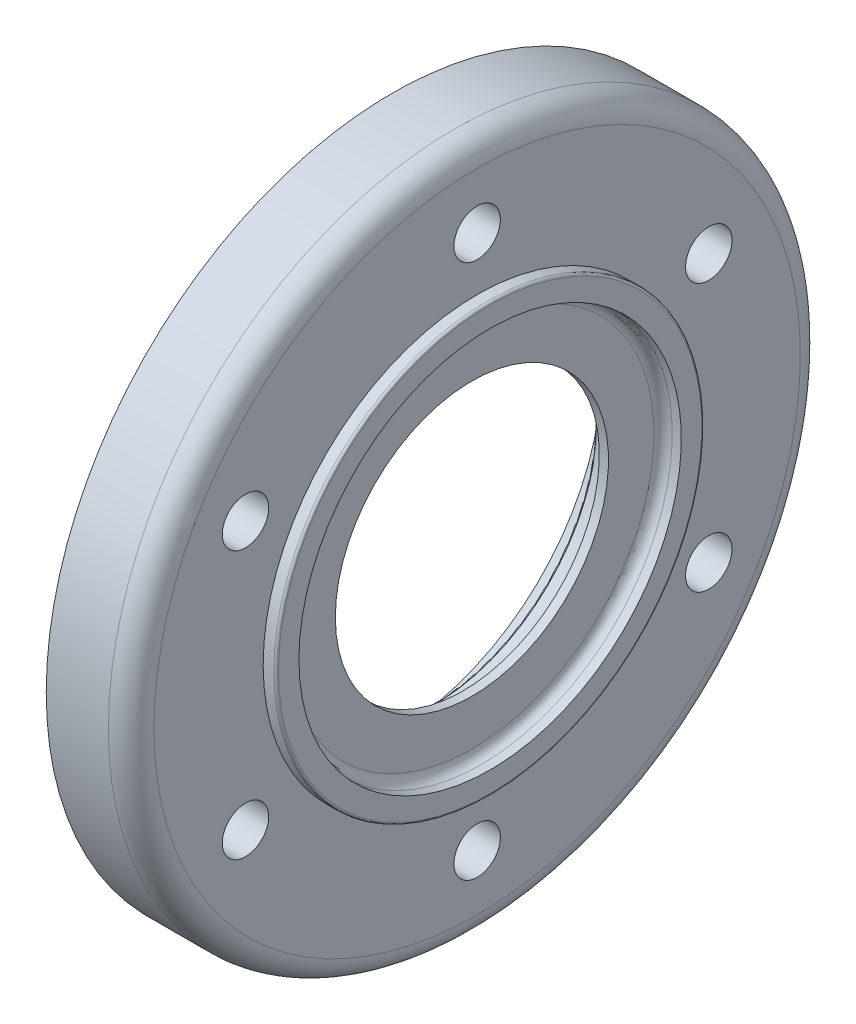
ISO-10303-21;
HEADER;
FILE_DESCRIPTION(('STEP AP214'),'2;1');
FILE_NAME('part.step','',(''),(''),'','','');
FILE_SCHEMA(('AUTOMOTIVE_DESIGN { 1 0 10303 214 1 1 1 1 }'));
ENDSEC;
DATA;
#1=APPLICATION_CONTEXT('core data for automotive mechanical design processes');
#2=APPLICATION_PROTOCOL_DEFINITION('international standard','automotive_design',2000,#1);
#3=PRODUCT_CONTEXT('',#1,'mechanical');
#4=PRODUCT('Part','Part','',(#3));
#5=PRODUCT_RELATED_PRODUCT_CATEGORY('part','',(#4));
#6=PRODUCT_DEFINITION_FORMATION('','',#4);
#7=PRODUCT_DEFINITION_CONTEXT('part definition',#1,'design');
#8=PRODUCT_DEFINITION('design','',#6,#7);
#9=PRODUCT_DEFINITION_SHAPE('','',#8);
#10=(LENGTH_UNIT() NAMED_UNIT(*) SI_UNIT(.MILLI.,.METRE.));
#11=(NAMED_UNIT(*) PLANE_ANGLE_UNIT() SI_UNIT($,.RADIAN.));
#12=(NAMED_UNIT(*) SI_UNIT($,.STERADIAN.) SOLID_ANGLE_UNIT());
#13=UNCERTAINTY_MEASURE_WITH_UNIT(LENGTH_MEASURE(1.E-05),#10,'distance_accuracy_value','');
#14=(GEOMETRIC_REPRESENTATION_CONTEXT(3) GLOBAL_UNCERTAINTY_ASSIGNED_CONTEXT((#13)) GLOBAL_UNIT_ASSIGNED_CONTEXT((#10,
#11,#12)) REPRESENTATION_CONTEXT('',''));
#15=CARTESIAN_POINT('',(0.,0.,0.));
#16=DIRECTION('',(0.,0.,1.));
#17=DIRECTION('',(1.,0.,0.));
#18=AXIS2_PLACEMENT_3D('',#15,#16,#17);
#19=CARTESIAN_POINT('',(0.595225647379466,0.,-36.));
#20=DIRECTION('',(1.,0.,0.));
#21=DIRECTION('',(0.,0.,-1.));
#22=AXIS2_PLACEMENT_3D('',#19,#20,#21);
#23=PLANE('',#22);
#24=CARTESIAN_POINT('',(0.595225647379467,0.,0.));
#25=DIRECTION('',(-1.,0.,0.));
#26=DIRECTION('',(0.,0.,1.));
#27=AXIS2_PLACEMENT_3D('',#24,#25,#26);
#28=CIRCLE('',#27,30.);
#29=CARTESIAN_POINT('',(0.595225647379467,0.,30.));
#30=VERTEX_POINT('',#29);
#31=EDGE_CURVE('E85',#30,#30,#28,.T.);
#32=ORIENTED_EDGE('',*,*,#31,.F.);
#33=EDGE_LOOP('',(#32));
#34=FACE_BOUND('',#33,.T.);
#35=CARTESIAN_POINT('',(0.595225647379466,0.,0.));
#36=DIRECTION('',(-1.,0.,0.));
#37=DIRECTION('',(0.,0.,1.));
#38=AXIS2_PLACEMENT_3D('',#35,#36,#37);
#39=CIRCLE('',#38,36.);
#40=CARTESIAN_POINT('',(0.595225647379466,0.,36.));
#41=VERTEX_POINT('',#40);
#42=EDGE_CURVE('E67',#41,#41,#39,.T.);
#43=ORIENTED_EDGE('',*,*,#42,.T.);
#44=EDGE_LOOP('',(#43));
#45=FACE_BOUND('',#44,.T.);
#46=ADVANCED_FACE('F41',(#34,#45),#23,.F.);
#47=CARTESIAN_POINT('',(0.,0.,0.));
#48=DIRECTION('',(-1.,0.,0.));
#49=DIRECTION('',(0.,0.,1.));
#50=AXIS2_PLACEMENT_3D('',#47,#48,#49);
#51=CYLINDRICAL_SURFACE('',#50,36.);
#52=CARTESIAN_POINT('',(-5.90477435262053,0.,0.));
#53=DIRECTION('',(1.,0.,0.));
#54=DIRECTION('',(0.,0.,-1.));
#55=AXIS2_PLACEMENT_3D('',#52,#53,#54);
#56=CIRCLE('',#55,36.);
#57=CARTESIAN_POINT('',(-5.90477435262053,0.,-36.));
#58=VERTEX_POINT('',#57);
#59=EDGE_CURVE('E64',#58,#58,#56,.F.);
#60=ORIENTED_EDGE('',*,*,#59,.T.);
#61=EDGE_LOOP('',(#60));
#62=FACE_BOUND('',#61,.T.);
#63=ORIENTED_EDGE('',*,*,#42,.F.);
#64=EDGE_LOOP('',(#63));
#65=FACE_BOUND('',#64,.T.);
#66=ADVANCED_FACE('F162',(#62,#65),#51,.F.);
#67=CARTESIAN_POINT('',(-6.40477435262053,0.,-46.));
#68=DIRECTION('',(1.,0.,0.));
#69=DIRECTION('',(0.,0.,-1.));
#70=AXIS2_PLACEMENT_3D('',#67,#68,#69);
#71=PLANE('',#70);
#72=CARTESIAN_POINT('',(-6.40477435262053,0.,0.));
#73=DIRECTION('',(1.,0.,0.));
#74=DIRECTION('',(0.,0.,-1.));
#75=AXIS2_PLACEMENT_3D('',#72,#73,#74);
#76=CIRCLE('',#75,36.5);
#77=CARTESIAN_POINT('',(-6.40477435262053,0.,-36.5));
#78=VERTEX_POINT('',#77);
#79=EDGE_CURVE('E61',#78,#78,#76,.T.);
#80=ORIENTED_EDGE('',*,*,#79,.T.);
#81=EDGE_LOOP('',(#80));
#82=FACE_BOUND('',#81,.T.);
#83=CARTESIAN_POINT('',(-6.40477435262053,0.,0.));
#84=DIRECTION('',(1.,0.,0.));
#85=DIRECTION('',(0.,0.,-1.));
#86=AXIS2_PLACEMENT_3D('',#83,#84,#85);
#87=CIRCLE('',#86,46.);
#88=CARTESIAN_POINT('',(-6.40477435262053,0.,-46.));
#89=VERTEX_POINT('',#88);
#90=EDGE_CURVE('E88',#89,#89,#87,.F.);
#91=ORIENTED_EDGE('',*,*,#90,.T.);
#92=EDGE_LOOP('',(#91));
#93=FACE_BOUND('',#92,.T.);
#94=ADVANCED_FACE('F152',(#82,#93),#71,.F.);
#95=CARTESIAN_POINT('',(0.,0.,0.));
#96=DIRECTION('',(-1.,0.,0.));
#97=DIRECTION('',(0.,0.,1.));
#98=AXIS2_PLACEMENT_3D('',#95,#96,#97);
#99=CYLINDRICAL_SURFACE('',#98,76.);
#100=CARTESIAN_POINT('',(-1.25563941521428,0.,0.));
#101=DIRECTION('',(-1.,0.,0.));
#102=DIRECTION('',(0.,0.,1.));
#103=AXIS2_PLACEMENT_3D('',#100,#101,#102);
#104=CIRCLE('',#103,76.);
#105=CARTESIAN_POINT('',(-1.25563941521428,0.,76.));
#106=VERTEX_POINT('',#105);
#107=EDGE_CURVE('E49',#106,#106,#104,.T.);
#108=ORIENTED_EDGE('',*,*,#107,.T.);
#109=EDGE_LOOP('',(#108));
#110=FACE_BOUND('',#109,.T.);
#111=CARTESIAN_POINT('',(-14.9047743526208,0.,0.));
#112=DIRECTION('',(1.,0.,0.));
#113=DIRECTION('',(0.,0.,-1.));
#114=AXIS2_PLACEMENT_3D('',#111,#112,#113);
#115=CIRCLE('',#114,76.);
#116=CARTESIAN_POINT('',(-14.9047743526208,0.,-76.));
#117=VERTEX_POINT('',#116);
#118=EDGE_CURVE('E109',#117,#117,#115,.T.);
#119=ORIENTED_EDGE('',*,*,#118,.T.);
#120=EDGE_LOOP('',(#119));
#121=FACE_BOUND('',#120,.T.);
#122=ADVANCED_FACE('F149',(#110,#121),#99,.T.);
#123=CARTESIAN_POINT('',(3.74436058478572,0.,-47.));
#124=DIRECTION('',(-1.,0.,0.));
#125=DIRECTION('',(0.,0.,1.));
#126=AXIS2_PLACEMENT_3D('',#123,#124,#125);
#127=PLANE('',#126);
#128=CARTESIAN_POINT('',(3.74436058478572,58.75,0.));
#129=DIRECTION('',(1.,0.,0.));
#130=DIRECTION('',(0.,0.,-1.));
#131=AXIS2_PLACEMENT_3D('',#128,#129,#130);
#132=CIRCLE('',#131,5.09999999999999);
#133=CARTESIAN_POINT('',(3.74436058478572,58.75,-5.1));
#134=VERTEX_POINT('',#133);
#135=EDGE_CURVE('E106',#134,#134,#132,.T.);
#136=ORIENTED_EDGE('',*,*,#135,.F.);
#137=EDGE_LOOP('',(#136));
#138=FACE_BOUND('',#137,.T.);
#139=CARTESIAN_POINT('',(3.74436058478572,29.3750000000022,-50.878992472337));
#140=DIRECTION('',(1.,0.,0.));
#141=DIRECTION('',(0.,0.,-1.));
#142=AXIS2_PLACEMENT_3D('',#139,#140,#141);
#143=CIRCLE('',#142,5.09999999999999);
#144=CARTESIAN_POINT('',(3.74436058478572,29.3750000000022,-55.978992472337));
#145=VERTEX_POINT('',#144);
#146=EDGE_CURVE('E103',#145,#145,#143,.T.);
#147=ORIENTED_EDGE('',*,*,#146,.F.);
#148=EDGE_LOOP('',(#147));
#149=FACE_BOUND('',#148,.T.);
#150=CARTESIAN_POINT('',(3.74436058478572,-29.3749999999978,-50.8789924723395));
#151=DIRECTION('',(1.,0.,0.));
#152=DIRECTION('',(0.,0.,-1.));
#153=AXIS2_PLACEMENT_3D('',#150,#151,#152);
#154=CIRCLE('',#153,5.1);
#155=CARTESIAN_POINT('',(3.74436058478572,-29.3749999999978,-55.9789924723395));
#156=VERTEX_POINT('',#155);
#157=EDGE_CURVE('E100',#156,#156,#154,.T.);
#158=ORIENTED_EDGE('',*,*,#157,.F.);
#159=EDGE_LOOP('',(#158));
#160=FACE_BOUND('',#159,.T.);
#161=CARTESIAN_POINT('',(3.74436058478572,-58.75,-4.98924207960269E-12));
#162=DIRECTION('',(1.,0.,0.));
#163=DIRECTION('',(0.,0.,-1.));
#164=AXIS2_PLACEMENT_3D('',#161,#162,#163);
#165=CIRCLE('',#164,5.09999999999999);
#166=CARTESIAN_POINT('',(3.74436058478572,-58.75,-5.10000000000498));
#167=VERTEX_POINT('',#166);
#168=EDGE_CURVE('E97',#167,#167,#165,.T.);
#169=ORIENTED_EDGE('',*,*,#168,.F.);
#170=EDGE_LOOP('',(#169));
#171=FACE_BOUND('',#170,.T.);
#172=CARTESIAN_POINT('',(3.74436058478572,-29.3750000000022,50.878992472332));
#173=DIRECTION('',(1.,0.,0.));
#174=DIRECTION('',(0.,0.,-1.));
#175=AXIS2_PLACEMENT_3D('',#172,#173,#174);
#176=CIRCLE('',#175,5.09999999999999);
#177=CARTESIAN_POINT('',(3.74436058478572,-29.3750000000022,45.778992472332));
#178=VERTEX_POINT('',#177);
#179=EDGE_CURVE('E94',#178,#178,#176,.T.);
#180=ORIENTED_EDGE('',*,*,#179,.F.);
#181=EDGE_LOOP('',(#180));
#182=FACE_BOUND('',#181,.T.);
#183=CARTESIAN_POINT('',(3.74436058478572,29.3749999999979,50.8789924723345));
#184=DIRECTION('',(1.,0.,0.));
#185=DIRECTION('',(0.,0.,-1.));
#186=AXIS2_PLACEMENT_3D('',#183,#184,#185);
#187=CIRCLE('',#186,5.1);
#188=CARTESIAN_POINT('',(3.74436058478572,29.3749999999979,45.7789924723345));
#189=VERTEX_POINT('',#188);
#190=EDGE_CURVE('E91',#189,#189,#187,.T.);
#191=ORIENTED_EDGE('',*,*,#190,.F.);
#192=EDGE_LOOP('',(#191));
#193=FACE_BOUND('',#192,.T.);
#194=CARTESIAN_POINT('',(3.74436058478572,0.,0.));
#195=DIRECTION('',(-1.,0.,0.));
#196=DIRECTION('',(0.,0.,1.));
#197=AXIS2_PLACEMENT_3D('',#194,#195,#196);
#198=CIRCLE('',#197,71.);
#199=CARTESIAN_POINT('',(3.74436058478572,0.,71.));
#200=VERTEX_POINT('',#199);
#201=EDGE_CURVE('E10',#200,#200,#198,.F.);
#202=ORIENTED_EDGE('',*,*,#201,.T.);
#203=EDGE_LOOP('',(#202));
#204=FACE_BOUND('',#203,.T.);
#205=CARTESIAN_POINT('',(3.74436058478572,0.,0.));
#206=DIRECTION('',(-1.,0.,0.));
#207=DIRECTION('',(0.,0.,1.));
#208=AXIS2_PLACEMENT_3D('',#205,#206,#207);
#209=CIRCLE('',#208,47.);
#210=CARTESIAN_POINT('',(3.74436058478572,0.,47.));
#211=VERTEX_POINT('',#210);
#212=EDGE_CURVE('E70',#211,#211,#209,.T.);
#213=ORIENTED_EDGE('',*,*,#212,.T.);
#214=EDGE_LOOP('',(#213));
#215=FACE_BOUND('',#214,.T.);
#216=ADVANCED_FACE('F151',(#138,#149,#160,#171,#182,#193,#204,#215),#127,.F.);
#217=CARTESIAN_POINT('',(0.,0.,0.));
#218=DIRECTION('',(-1.,0.,0.));
#219=DIRECTION('',(0.,0.,1.));
#220=AXIS2_PLACEMENT_3D('',#217,#218,#219);
#221=CYLINDRICAL_SURFACE('',#220,47.);
#222=CARTESIAN_POINT('',(6.09522564737947,0.,0.));
#223=DIRECTION('',(-1.,0.,0.));
#224=DIRECTION('',(0.,0.,1.));
#225=AXIS2_PLACEMENT_3D('',#222,#223,#224);
#226=CIRCLE('',#225,47.);
#227=CARTESIAN_POINT('',(6.09522564737947,0.,47.));
#228=VERTEX_POINT('',#227);
#229=EDGE_CURVE('E58',#228,#228,#226,.T.);
#230=ORIENTED_EDGE('',*,*,#229,.T.);
#231=EDGE_LOOP('',(#230));
#232=FACE_BOUND('',#231,.T.);
#233=ORIENTED_EDGE('',*,*,#212,.F.);
#234=EDGE_LOOP('',(#233));
#235=FACE_BOUND('',#234,.T.);
#236=ADVANCED_FACE('F159',(#232,#235),#221,.T.);
#237=CARTESIAN_POINT('',(6.59522564737947,0.,-42.));
#238=DIRECTION('',(-1.,0.,0.));
#239=DIRECTION('',(0.,0.,1.));
#240=AXIS2_PLACEMENT_3D('',#237,#238,#239);
#241=PLANE('',#240);
#242=CARTESIAN_POINT('',(6.59522564737947,0.,0.));
#243=DIRECTION('',(-1.,0.,0.));
#244=DIRECTION('',(0.,0.,1.));
#245=AXIS2_PLACEMENT_3D('',#242,#243,#244);
#246=CIRCLE('',#245,46.5);
#247=CARTESIAN_POINT('',(6.59522564737947,0.,46.5));
#248=VERTEX_POINT('',#247);
#249=EDGE_CURVE('E53',#248,#248,#246,.F.);
#250=ORIENTED_EDGE('',*,*,#249,.T.);
#251=EDGE_LOOP('',(#250));
#252=FACE_BOUND('',#251,.T.);
#253=CARTESIAN_POINT('',(6.59522564737947,0.,0.));
#254=DIRECTION('',(-1.,0.,0.));
#255=DIRECTION('',(0.,0.,1.));
#256=AXIS2_PLACEMENT_3D('',#253,#254,#255);
#257=CIRCLE('',#256,42.);
#258=CARTESIAN_POINT('',(6.59522564737947,0.,42.));
#259=VERTEX_POINT('',#258);
#260=EDGE_CURVE('E73',#259,#259,#257,.T.);
#261=ORIENTED_EDGE('',*,*,#260,.T.);
#262=EDGE_LOOP('',(#261));
#263=FACE_BOUND('',#262,.T.);
#264=ADVANCED_FACE('F195',(#252,#263),#241,.F.);
#265=CARTESIAN_POINT('',(0.,0.,0.));
#266=DIRECTION('',(-1.,0.,0.));
#267=DIRECTION('',(0.,0.,1.));
#268=AXIS2_PLACEMENT_3D('',#265,#266,#267);
#269=CYLINDRICAL_SURFACE('',#268,42.);
#270=ORIENTED_EDGE('',*,*,#260,.F.);
#271=EDGE_LOOP('',(#270));
#272=FACE_BOUND('',#271,.T.);
#273=CARTESIAN_POINT('',(4.59522564737947,0.,0.));
#274=DIRECTION('',(-1.,0.,0.));
#275=DIRECTION('',(0.,0.,1.));
#276=AXIS2_PLACEMENT_3D('',#273,#274,#275);
#277=CIRCLE('',#276,42.);
#278=CARTESIAN_POINT('',(4.59522564737947,0.,42.));
#279=VERTEX_POINT('',#278);
#280=EDGE_CURVE('E76',#279,#279,#277,.T.);
#281=ORIENTED_EDGE('',*,*,#280,.T.);
#282=EDGE_LOOP('',(#281));
#283=FACE_BOUND('',#282,.T.);
#284=ADVANCED_FACE('F202',(#272,#283),#269,.F.);
#285=CARTESIAN_POINT('',(4.59522564737947,0.,0.));
#286=DIRECTION('',(-1.,0.,0.));
#287=DIRECTION('',(0.,0.,1.));
#288=AXIS2_PLACEMENT_3D('',#285,#286,#287);
#289=TOROIDAL_SURFACE('',#288,40.,2.);
#290=ORIENTED_EDGE('',*,*,#280,.F.);
#291=EDGE_LOOP('',(#290));
#292=FACE_BOUND('',#291,.T.);
#293=CARTESIAN_POINT('',(2.59522564737947,0.,0.));
#294=DIRECTION('',(-1.,0.,0.));
#295=DIRECTION('',(0.,0.,1.));
#296=AXIS2_PLACEMENT_3D('',#293,#294,#295);
#297=CIRCLE('',#296,40.);
#298=CARTESIAN_POINT('',(2.59522564737947,0.,40.));
#299=VERTEX_POINT('',#298);
#300=EDGE_CURVE('E79',#299,#299,#297,.T.);
#301=ORIENTED_EDGE('',*,*,#300,.T.);
#302=EDGE_LOOP('',(#301));
#303=FACE_BOUND('',#302,.T.);
#304=ADVANCED_FACE('F208',(#292,#303),#289,.F.);
#305=CARTESIAN_POINT('',(2.59522564737947,0.,-30.));
#306=DIRECTION('',(-1.,0.,0.));
#307=DIRECTION('',(0.,0.,1.));
#308=AXIS2_PLACEMENT_3D('',#305,#306,#307);
#309=PLANE('',#308);
#310=ORIENTED_EDGE('',*,*,#300,.F.);
#311=EDGE_LOOP('',(#310));
#312=FACE_BOUND('',#311,.T.);
#313=CARTESIAN_POINT('',(2.59522564737947,0.,0.));
#314=DIRECTION('',(-1.,0.,0.));
#315=DIRECTION('',(0.,0.,1.));
#316=AXIS2_PLACEMENT_3D('',#313,#314,#315);
#317=CIRCLE('',#316,30.);
#318=CARTESIAN_POINT('',(2.59522564737947,0.,30.));
#319=VERTEX_POINT('',#318);
#320=EDGE_CURVE('E82',#319,#319,#317,.T.);
#321=ORIENTED_EDGE('',*,*,#320,.T.);
#322=EDGE_LOOP('',(#321));
#323=FACE_BOUND('',#322,.T.);
#324=ADVANCED_FACE('F212',(#312,#323),#309,.F.);
#325=CARTESIAN_POINT('',(0.,0.,0.));
#326=DIRECTION('',(-1.,0.,0.));
#327=DIRECTION('',(0.,0.,1.));
#328=AXIS2_PLACEMENT_3D('',#325,#326,#327);
#329=CYLINDRICAL_SURFACE('',#328,30.);
#330=ORIENTED_EDGE('',*,*,#320,.F.);
#331=EDGE_LOOP('',(#330));
#332=FACE_BOUND('',#331,.T.);
#333=ORIENTED_EDGE('',*,*,#31,.T.);
#334=EDGE_LOOP('',(#333));
#335=FACE_BOUND('',#334,.T.);
#336=ADVANCED_FACE('F179',(#332,#335),#329,.F.);
#337=CARTESIAN_POINT('',(-5.90477435262053,0.,0.));
#338=DIRECTION('',(1.,0.,0.));
#339=DIRECTION('',(0.,0.,-1.));
#340=AXIS2_PLACEMENT_3D('',#337,#338,#339);
#341=TOROIDAL_SURFACE('',#340,36.5,0.5);
#342=ORIENTED_EDGE('',*,*,#79,.F.);
#343=EDGE_LOOP('',(#342));
#344=FACE_BOUND('',#343,.T.);
#345=ORIENTED_EDGE('',*,*,#59,.F.);
#346=EDGE_LOOP('',(#345));
#347=FACE_BOUND('',#346,.T.);
#348=ADVANCED_FACE('F176',(#344,#347),#341,.T.);
#349=CARTESIAN_POINT('',(6.09522564737947,0.,0.));
#350=DIRECTION('',(-1.,0.,0.));
#351=DIRECTION('',(0.,0.,1.));
#352=AXIS2_PLACEMENT_3D('',#349,#350,#351);
#353=TOROIDAL_SURFACE('',#352,46.5,0.5);
#354=ORIENTED_EDGE('',*,*,#249,.F.);
#355=EDGE_LOOP('',(#354));
#356=FACE_BOUND('',#355,.T.);
#357=ORIENTED_EDGE('',*,*,#229,.F.);
#358=EDGE_LOOP('',(#357));
#359=FACE_BOUND('',#358,.T.);
#360=ADVANCED_FACE('F178',(#356,#359),#353,.T.);
#361=CARTESIAN_POINT('',(-20.9056394152143,0.,0.));
#362=DIRECTION('',(1.,0.,0.));
#363=DIRECTION('',(0.,0.,-1.));
#364=AXIS2_PLACEMENT_3D('',#361,#362,#363);
#365=CYLINDRICAL_SURFACE('',#364,46.);
#366=CARTESIAN_POINT('',(-14.9047743526208,0.,0.));
#367=DIRECTION('',(1.,0.,0.));
#368=DIRECTION('',(0.,0.,-1.));
#369=AXIS2_PLACEMENT_3D('',#366,#367,#368);
#370=CIRCLE('',#369,46.);
#371=CARTESIAN_POINT('',(-14.9047743526208,0.,-46.));
#372=VERTEX_POINT('',#371);
#373=EDGE_CURVE('E112',#372,#372,#370,.T.);
#374=ORIENTED_EDGE('',*,*,#373,.F.);
#375=EDGE_LOOP('',(#374));
#376=FACE_BOUND('',#375,.T.);
#377=ORIENTED_EDGE('',*,*,#90,.F.);
#378=EDGE_LOOP('',(#377));
#379=FACE_BOUND('',#378,.T.);
#380=ADVANCED_FACE('F182',(#376,#379),#365,.F.);
#381=CARTESIAN_POINT('',(-1.25563941521428,0.,0.));
#382=DIRECTION('',(-1.,0.,0.));
#383=DIRECTION('',(0.,0.,1.));
#384=AXIS2_PLACEMENT_3D('',#381,#382,#383);
#385=TOROIDAL_SURFACE('',#384,71.,5.);
#386=ORIENTED_EDGE('',*,*,#201,.F.);
#387=EDGE_LOOP('',(#386));
#388=FACE_BOUND('',#387,.T.);
#389=ORIENTED_EDGE('',*,*,#107,.F.);
#390=EDGE_LOOP('',(#389));
#391=FACE_BOUND('',#390,.T.);
#392=ADVANCED_FACE('F43',(#388,#391),#385,.T.);
#393=CARTESIAN_POINT('',(3.74436058478572,29.3749999999979,50.8789924723345));
#394=DIRECTION('',(1.,0.,0.));
#395=DIRECTION('',(0.,0.,-1.));
#396=AXIS2_PLACEMENT_3D('',#393,#394,#395);
#397=CYLINDRICAL_SURFACE('',#396,5.09999999999999);
#398=CARTESIAN_POINT('',(-14.9047743526208,29.3749999999979,50.8789924723345));
#399=DIRECTION('',(1.,0.,0.));
#400=DIRECTION('',(0.,0.,-1.));
#401=AXIS2_PLACEMENT_3D('',#398,#399,#400);
#402=CIRCLE('',#401,5.09999999999999);
#403=CARTESIAN_POINT('',(-14.9047743526208,29.3749999999979,45.7789924723345));
#404=VERTEX_POINT('',#403);
#405=EDGE_CURVE('E115',#404,#404,#402,.F.);
#406=ORIENTED_EDGE('',*,*,#405,.T.);
#407=EDGE_LOOP('',(#406));
#408=FACE_BOUND('',#407,.T.);
#409=ORIENTED_EDGE('',*,*,#190,.T.);
#410=EDGE_LOOP('',(#409));
#411=FACE_BOUND('',#410,.T.);
#412=ADVANCED_FACE('F220',(#408,#411),#397,.F.);
#413=CARTESIAN_POINT('',(3.74436058478572,-29.3750000000022,50.878992472332));
#414=DIRECTION('',(1.,0.,0.));
#415=DIRECTION('',(0.,0.,-1.));
#416=AXIS2_PLACEMENT_3D('',#413,#414,#415);
#417=CYLINDRICAL_SURFACE('',#416,5.09999999999999);
#418=CARTESIAN_POINT('',(-14.9047743526208,-29.3750000000022,50.878992472332));
#419=DIRECTION('',(1.,0.,0.));
#420=DIRECTION('',(0.,0.,-1.));
#421=AXIS2_PLACEMENT_3D('',#418,#419,#420);
#422=CIRCLE('',#421,5.09999999999999);
#423=CARTESIAN_POINT('',(-14.9047743526208,-29.3750000000022,45.778992472332));
#424=VERTEX_POINT('',#423);
#425=EDGE_CURVE('E118',#424,#424,#422,.F.);
#426=ORIENTED_EDGE('',*,*,#425,.T.);
#427=EDGE_LOOP('',(#426));
#428=FACE_BOUND('',#427,.T.);
#429=ORIENTED_EDGE('',*,*,#179,.T.);
#430=EDGE_LOOP('',(#429));
#431=FACE_BOUND('',#430,.T.);
#432=ADVANCED_FACE('F223',(#428,#431),#417,.F.);
#433=CARTESIAN_POINT('',(3.74436058478572,-58.75,-4.98924207960269E-12));
#434=DIRECTION('',(1.,0.,0.));
#435=DIRECTION('',(0.,0.,-1.));
#436=AXIS2_PLACEMENT_3D('',#433,#434,#435);
#437=CYLINDRICAL_SURFACE('',#436,5.09999999999999);
#438=CARTESIAN_POINT('',(-14.9047743526208,-58.75,-4.98924207960269E-12));
#439=DIRECTION('',(1.,0.,0.));
#440=DIRECTION('',(0.,0.,-1.));
#441=AXIS2_PLACEMENT_3D('',#438,#439,#440);
#442=CIRCLE('',#441,5.09999999999999);
#443=CARTESIAN_POINT('',(-14.9047743526208,-58.75,-5.10000000000498));
#444=VERTEX_POINT('',#443);
#445=EDGE_CURVE('E121',#444,#444,#442,.F.);
#446=ORIENTED_EDGE('',*,*,#445,.T.);
#447=EDGE_LOOP('',(#446));
#448=FACE_BOUND('',#447,.T.);
#449=ORIENTED_EDGE('',*,*,#168,.T.);
#450=EDGE_LOOP('',(#449));
#451=FACE_BOUND('',#450,.T.);
#452=ADVANCED_FACE('F227',(#448,#451),#437,.F.);
#453=CARTESIAN_POINT('',(3.74436058478572,-29.3749999999978,-50.8789924723395));
#454=DIRECTION('',(1.,0.,0.));
#455=DIRECTION('',(0.,0.,-1.));
#456=AXIS2_PLACEMENT_3D('',#453,#454,#455);
#457=CYLINDRICAL_SURFACE('',#456,5.09999999999999);
#458=CARTESIAN_POINT('',(-14.9047743526208,-29.3749999999978,-50.8789924723395));
#459=DIRECTION('',(1.,0.,0.));
#460=DIRECTION('',(0.,0.,-1.));
#461=AXIS2_PLACEMENT_3D('',#458,#459,#460);
#462=CIRCLE('',#461,5.09999999999999);
#463=CARTESIAN_POINT('',(-14.9047743526208,-29.3749999999978,-55.9789924723395));
#464=VERTEX_POINT('',#463);
#465=EDGE_CURVE('E124',#464,#464,#462,.F.);
#466=ORIENTED_EDGE('',*,*,#465,.T.);
#467=EDGE_LOOP('',(#466));
#468=FACE_BOUND('',#467,.T.);
#469=ORIENTED_EDGE('',*,*,#157,.T.);
#470=EDGE_LOOP('',(#469));
#471=FACE_BOUND('',#470,.T.);
#472=ADVANCED_FACE('F231',(#468,#471),#457,.F.);
#473=CARTESIAN_POINT('',(3.74436058478572,29.3750000000022,-50.878992472337));
#474=DIRECTION('',(1.,0.,0.));
#475=DIRECTION('',(0.,0.,-1.));
#476=AXIS2_PLACEMENT_3D('',#473,#474,#475);
#477=CYLINDRICAL_SURFACE('',#476,5.09999999999999);
#478=CARTESIAN_POINT('',(-14.9047743526208,29.3750000000022,-50.878992472337));
#479=DIRECTION('',(1.,0.,0.));
#480=DIRECTION('',(0.,0.,-1.));
#481=AXIS2_PLACEMENT_3D('',#478,#479,#480);
#482=CIRCLE('',#481,5.09999999999999);
#483=CARTESIAN_POINT('',(-14.9047743526208,29.3750000000022,-55.978992472337));
#484=VERTEX_POINT('',#483);
#485=EDGE_CURVE('E127',#484,#484,#482,.F.);
#486=ORIENTED_EDGE('',*,*,#485,.T.);
#487=EDGE_LOOP('',(#486));
#488=FACE_BOUND('',#487,.T.);
#489=ORIENTED_EDGE('',*,*,#146,.T.);
#490=EDGE_LOOP('',(#489));
#491=FACE_BOUND('',#490,.T.);
#492=ADVANCED_FACE('F235',(#488,#491),#477,.F.);
#493=CARTESIAN_POINT('',(3.74436058478572,58.75,0.));
#494=DIRECTION('',(1.,0.,0.));
#495=DIRECTION('',(0.,0.,-1.));
#496=AXIS2_PLACEMENT_3D('',#493,#494,#495);
#497=CYLINDRICAL_SURFACE('',#496,5.09999999999999);
#498=CARTESIAN_POINT('',(-14.9047743526208,58.75,0.));
#499=DIRECTION('',(1.,0.,0.));
#500=DIRECTION('',(0.,0.,-1.));
#501=AXIS2_PLACEMENT_3D('',#498,#499,#500);
#502=CIRCLE('',#501,5.09999999999999);
#503=CARTESIAN_POINT('',(-14.9047743526208,58.75,-5.1));
#504=VERTEX_POINT('',#503);
#505=EDGE_CURVE('E45',#504,#504,#502,.F.);
#506=ORIENTED_EDGE('',*,*,#505,.T.);
#507=EDGE_LOOP('',(#506));
#508=FACE_BOUND('',#507,.T.);
#509=ORIENTED_EDGE('',*,*,#135,.T.);
#510=EDGE_LOOP('',(#509));
#511=FACE_BOUND('',#510,.T.);
#512=ADVANCED_FACE('F134',(#508,#511),#497,.F.);
#513=CARTESIAN_POINT('',(-14.9047743526208,-99.,-76.));
#514=DIRECTION('',(1.,0.,0.));
#515=DIRECTION('',(0.,0.,-1.));
#516=AXIS2_PLACEMENT_3D('',#513,#514,#515);
#517=PLANE('',#516);
#518=ORIENTED_EDGE('',*,*,#373,.T.);
#519=EDGE_LOOP('',(#518));
#520=FACE_BOUND('',#519,.T.);
#521=ORIENTED_EDGE('',*,*,#425,.F.);
#522=EDGE_LOOP('',(#521));
#523=FACE_BOUND('',#522,.T.);
#524=ORIENTED_EDGE('',*,*,#465,.F.);
#525=EDGE_LOOP('',(#524));
#526=FACE_BOUND('',#525,.T.);
#527=ORIENTED_EDGE('',*,*,#505,.F.);
#528=EDGE_LOOP('',(#527));
#529=FACE_BOUND('',#528,.T.);
#530=ORIENTED_EDGE('',*,*,#485,.F.);
#531=EDGE_LOOP('',(#530));
#532=FACE_BOUND('',#531,.T.);
#533=ORIENTED_EDGE('',*,*,#445,.F.);
#534=EDGE_LOOP('',(#533));
#535=FACE_BOUND('',#534,.T.);
#536=ORIENTED_EDGE('',*,*,#405,.F.);
#537=EDGE_LOOP('',(#536));
#538=FACE_BOUND('',#537,.T.);
#539=ORIENTED_EDGE('',*,*,#118,.F.);
#540=EDGE_LOOP('',(#539));
#541=FACE_BOUND('',#540,.T.);
#542=ADVANCED_FACE('F137',(#520,#523,#526,#529,#532,#535,#538,#541),#517,.F.);
#543=CLOSED_SHELL('',(#46,#66,#94,#122,#216,#236,#264,#284,#304,#324,#336,#348,#360,#380,#392,
#412,#432,#452,#472,#492,#512,#542));
#544=MANIFOLD_SOLID_BREP('B2',#543);
#545=ADVANCED_BREP_SHAPE_REPRESENTATION('',(#18,#544),#14);
#546=SHAPE_DEFINITION_REPRESENTATION(#9,#545);
ENDSEC;
END-ISO-10303-21;
